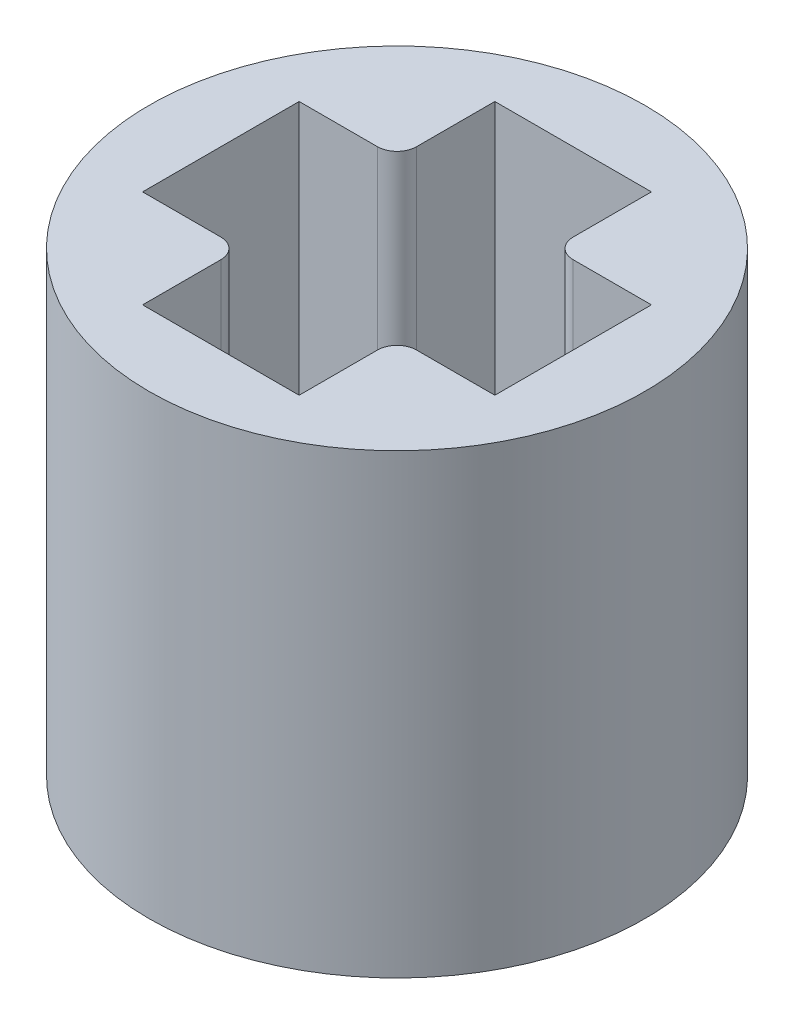
ISO-10303-21;
HEADER;
FILE_DESCRIPTION(('STEP AP214'),'2;1');
FILE_NAME('part.step','',(''),(''),'','','');
FILE_SCHEMA(('AUTOMOTIVE_DESIGN { 1 0 10303 214 1 1 1 1 }'));
ENDSEC;
DATA;
#1=APPLICATION_CONTEXT('core data for automotive mechanical design processes');
#2=APPLICATION_PROTOCOL_DEFINITION('international standard','automotive_design',2000,#1);
#3=PRODUCT_CONTEXT('',#1,'mechanical');
#4=PRODUCT('Part','Part','',(#3));
#5=PRODUCT_RELATED_PRODUCT_CATEGORY('part','',(#4));
#6=PRODUCT_DEFINITION_FORMATION('','',#4);
#7=PRODUCT_DEFINITION_CONTEXT('part definition',#1,'design');
#8=PRODUCT_DEFINITION('design','',#6,#7);
#9=PRODUCT_DEFINITION_SHAPE('','',#8);
#10=(LENGTH_UNIT() NAMED_UNIT(*) SI_UNIT(.MILLI.,.METRE.));
#11=(NAMED_UNIT(*) PLANE_ANGLE_UNIT() SI_UNIT($,.RADIAN.));
#12=(NAMED_UNIT(*) SI_UNIT($,.STERADIAN.) SOLID_ANGLE_UNIT());
#13=UNCERTAINTY_MEASURE_WITH_UNIT(LENGTH_MEASURE(1.E-05),#10,'distance_accuracy_value','');
#14=(GEOMETRIC_REPRESENTATION_CONTEXT(3) GLOBAL_UNCERTAINTY_ASSIGNED_CONTEXT((#13)) GLOBAL_UNIT_ASSIGNED_CONTEXT((#10,
#11,#12)) REPRESENTATION_CONTEXT('',''));
#15=CARTESIAN_POINT('',(0.,0.,0.));
#16=DIRECTION('',(0.,0.,1.));
#17=DIRECTION('',(1.,0.,0.));
#18=AXIS2_PLACEMENT_3D('',#15,#16,#17);
#19=CARTESIAN_POINT('',(0.,7.,0.));
#20=DIRECTION('',(0.,1.,0.));
#21=DIRECTION('',(0.,0.,1.));
#22=AXIS2_PLACEMENT_3D('',#19,#20,#21);
#23=PLANE('',#22);
#24=CARTESIAN_POINT('',(0.,7.,0.));
#25=DIRECTION('',(0.,1.,0.));
#26=DIRECTION('',(0.,0.,1.));
#27=AXIS2_PLACEMENT_3D('',#24,#25,#26);
#28=CIRCLE('',#27,3.8);
#29=CARTESIAN_POINT('',(0.,7.,3.8));
#30=VERTEX_POINT('',#29);
#31=EDGE_CURVE('E11',#30,#30,#28,.T.);
#32=ORIENTED_EDGE('',*,*,#31,.T.);
#33=EDGE_LOOP('',(#32));
#34=FACE_BOUND('',#33,.T.);
#35=DIRECTION('',(1.,0.,0.));
#36=VECTOR('',#35,1.);
#37=CARTESIAN_POINT('',(1.5,7.,1.2));
#38=LINE('',#37,#36);
#39=CARTESIAN_POINT('',(1.5,7.,1.2));
#40=VERTEX_POINT('',#39);
#41=CARTESIAN_POINT('',(2.7,7.,1.2));
#42=VERTEX_POINT('',#41);
#43=EDGE_CURVE('E162',#40,#42,#38,.T.);
#44=ORIENTED_EDGE('',*,*,#43,.F.);
#45=CARTESIAN_POINT('',(1.5,7.,1.5));
#46=DIRECTION('',(0.,-1.,0.));
#47=DIRECTION('',(0.,0.,-1.));
#48=AXIS2_PLACEMENT_3D('',#45,#46,#47);
#49=CIRCLE('',#48,0.3);
#50=CARTESIAN_POINT('',(1.2,7.,1.5));
#51=VERTEX_POINT('',#50);
#52=EDGE_CURVE('E153',#51,#40,#49,.T.);
#53=ORIENTED_EDGE('',*,*,#52,.F.);
#54=DIRECTION('',(0.,0.,-1.));
#55=VECTOR('',#54,1.);
#56=CARTESIAN_POINT('',(1.2,7.,2.7));
#57=LINE('',#56,#55);
#58=CARTESIAN_POINT('',(1.2,7.,2.7));
#59=VERTEX_POINT('',#58);
#60=EDGE_CURVE('E217',#59,#51,#57,.T.);
#61=ORIENTED_EDGE('',*,*,#60,.F.);
#62=DIRECTION('',(1.,0.,0.));
#63=VECTOR('',#62,1.);
#64=CARTESIAN_POINT('',(-1.2,7.,2.7));
#65=LINE('',#64,#63);
#66=CARTESIAN_POINT('',(-1.2,7.,2.7));
#67=VERTEX_POINT('',#66);
#68=EDGE_CURVE('E214',#67,#59,#65,.T.);
#69=ORIENTED_EDGE('',*,*,#68,.F.);
#70=DIRECTION('',(0.,0.,1.));
#71=VECTOR('',#70,1.);
#72=CARTESIAN_POINT('',(-1.2,7.,2.7));
#73=LINE('',#72,#71);
#74=CARTESIAN_POINT('',(-1.2,7.,1.5));
#75=VERTEX_POINT('',#74);
#76=EDGE_CURVE('E211',#75,#67,#73,.T.);
#77=ORIENTED_EDGE('',*,*,#76,.F.);
#78=CARTESIAN_POINT('',(-1.5,7.,1.5));
#79=DIRECTION('',(0.,-1.,0.));
#80=DIRECTION('',(0.,0.,-1.));
#81=AXIS2_PLACEMENT_3D('',#78,#79,#80);
#82=CIRCLE('',#81,0.3);
#83=CARTESIAN_POINT('',(-1.5,7.,1.2));
#84=VERTEX_POINT('',#83);
#85=EDGE_CURVE('E208',#84,#75,#82,.T.);
#86=ORIENTED_EDGE('',*,*,#85,.F.);
#87=DIRECTION('',(1.,0.,0.));
#88=VECTOR('',#87,1.);
#89=CARTESIAN_POINT('',(-1.5,7.,1.2));
#90=LINE('',#89,#88);
#91=CARTESIAN_POINT('',(-2.7,7.,1.2));
#92=VERTEX_POINT('',#91);
#93=EDGE_CURVE('E205',#92,#84,#90,.T.);
#94=ORIENTED_EDGE('',*,*,#93,.F.);
#95=DIRECTION('',(0.,0.,1.));
#96=VECTOR('',#95,1.);
#97=CARTESIAN_POINT('',(-2.7,7.,1.2));
#98=LINE('',#97,#96);
#99=CARTESIAN_POINT('',(-2.7,7.,-1.2));
#100=VERTEX_POINT('',#99);
#101=EDGE_CURVE('E202',#100,#92,#98,.T.);
#102=ORIENTED_EDGE('',*,*,#101,.F.);
#103=DIRECTION('',(-1.,0.,0.));
#104=VECTOR('',#103,1.);
#105=CARTESIAN_POINT('',(-1.5,7.,-1.2));
#106=LINE('',#105,#104);
#107=CARTESIAN_POINT('',(-1.5,7.,-1.2));
#108=VERTEX_POINT('',#107);
#109=EDGE_CURVE('E199',#108,#100,#106,.T.);
#110=ORIENTED_EDGE('',*,*,#109,.F.);
#111=CARTESIAN_POINT('',(-1.5,7.,-1.5));
#112=DIRECTION('',(0.,-1.,0.));
#113=DIRECTION('',(0.,0.,-1.));
#114=AXIS2_PLACEMENT_3D('',#111,#112,#113);
#115=CIRCLE('',#114,0.3);
#116=CARTESIAN_POINT('',(-1.2,7.,-1.5));
#117=VERTEX_POINT('',#116);
#118=EDGE_CURVE('E196',#117,#108,#115,.T.);
#119=ORIENTED_EDGE('',*,*,#118,.F.);
#120=DIRECTION('',(0.,0.,1.));
#121=VECTOR('',#120,1.);
#122=CARTESIAN_POINT('',(-1.2,7.,-2.7));
#123=LINE('',#122,#121);
#124=CARTESIAN_POINT('',(-1.2,7.,-2.7));
#125=VERTEX_POINT('',#124);
#126=EDGE_CURVE('E193',#125,#117,#123,.T.);
#127=ORIENTED_EDGE('',*,*,#126,.F.);
#128=DIRECTION('',(-1.,0.,0.));
#129=VECTOR('',#128,1.);
#130=CARTESIAN_POINT('',(-1.2,7.,-2.7));
#131=LINE('',#130,#129);
#132=CARTESIAN_POINT('',(1.2,7.,-2.7));
#133=VERTEX_POINT('',#132);
#134=EDGE_CURVE('E190',#133,#125,#131,.T.);
#135=ORIENTED_EDGE('',*,*,#134,.F.);
#136=DIRECTION('',(0.,0.,-1.));
#137=VECTOR('',#136,1.);
#138=CARTESIAN_POINT('',(1.2,7.,-2.7));
#139=LINE('',#138,#137);
#140=CARTESIAN_POINT('',(1.2,7.,-1.5));
#141=VERTEX_POINT('',#140);
#142=EDGE_CURVE('E187',#141,#133,#139,.T.);
#143=ORIENTED_EDGE('',*,*,#142,.F.);
#144=CARTESIAN_POINT('',(1.5,7.,-1.5));
#145=DIRECTION('',(0.,-1.,0.));
#146=DIRECTION('',(0.,0.,-1.));
#147=AXIS2_PLACEMENT_3D('',#144,#145,#146);
#148=CIRCLE('',#147,0.3);
#149=CARTESIAN_POINT('',(1.5,7.,-1.2));
#150=VERTEX_POINT('',#149);
#151=EDGE_CURVE('E184',#150,#141,#148,.T.);
#152=ORIENTED_EDGE('',*,*,#151,.F.);
#153=DIRECTION('',(-1.,0.,0.));
#154=VECTOR('',#153,1.);
#155=CARTESIAN_POINT('',(1.5,7.,-1.2));
#156=LINE('',#155,#154);
#157=CARTESIAN_POINT('',(2.7,7.,-1.2));
#158=VERTEX_POINT('',#157);
#159=EDGE_CURVE('E179',#158,#150,#156,.T.);
#160=ORIENTED_EDGE('',*,*,#159,.F.);
#161=DIRECTION('',(0.,0.,-1.));
#162=VECTOR('',#161,1.);
#163=CARTESIAN_POINT('',(2.7,7.,1.2));
#164=LINE('',#163,#162);
#165=EDGE_CURVE('E175',#42,#158,#164,.T.);
#166=ORIENTED_EDGE('',*,*,#165,.F.);
#167=EDGE_LOOP('',(#44,#53,#61,#69,#77,#86,#94,#102,#110,#119,#127,#135,#143,#152,#160,#166));
#168=FACE_BOUND('',#167,.T.);
#169=ADVANCED_FACE('F39',(#34,#168),#23,.T.);
#170=CARTESIAN_POINT('',(0.,0.,0.));
#171=DIRECTION('',(0.,1.,0.));
#172=DIRECTION('',(0.,0.,1.));
#173=AXIS2_PLACEMENT_3D('',#170,#171,#172);
#174=PLANE('',#173);
#175=CARTESIAN_POINT('',(0.,0.,0.));
#176=DIRECTION('',(0.,1.,0.));
#177=DIRECTION('',(0.,0.,1.));
#178=AXIS2_PLACEMENT_3D('',#175,#176,#177);
#179=CIRCLE('',#178,3.8);
#180=CARTESIAN_POINT('',(0.,0.,3.8));
#181=VERTEX_POINT('',#180);
#182=EDGE_CURVE('E43',#181,#181,#179,.T.);
#183=ORIENTED_EDGE('',*,*,#182,.F.);
#184=EDGE_LOOP('',(#183));
#185=FACE_BOUND('',#184,.T.);
#186=CARTESIAN_POINT('',(1.5,0.,1.5));
#187=DIRECTION('',(0.,-1.,0.));
#188=DIRECTION('',(0.,0.,-1.));
#189=AXIS2_PLACEMENT_3D('',#186,#187,#188);
#190=CIRCLE('',#189,0.3);
#191=CARTESIAN_POINT('',(1.2,0.,1.5));
#192=VERTEX_POINT('',#191);
#193=CARTESIAN_POINT('',(1.5,0.,1.2));
#194=VERTEX_POINT('',#193);
#195=EDGE_CURVE('E63',#192,#194,#190,.T.);
#196=ORIENTED_EDGE('',*,*,#195,.T.);
#197=DIRECTION('',(1.,0.,0.));
#198=VECTOR('',#197,1.);
#199=CARTESIAN_POINT('',(1.5,0.,1.2));
#200=LINE('',#199,#198);
#201=CARTESIAN_POINT('',(2.7,0.,1.2));
#202=VERTEX_POINT('',#201);
#203=EDGE_CURVE('E169',#194,#202,#200,.T.);
#204=ORIENTED_EDGE('',*,*,#203,.T.);
#205=DIRECTION('',(0.,0.,-1.));
#206=VECTOR('',#205,1.);
#207=CARTESIAN_POINT('',(2.7,0.,1.2));
#208=LINE('',#207,#206);
#209=CARTESIAN_POINT('',(2.7,0.,-1.2));
#210=VERTEX_POINT('',#209);
#211=EDGE_CURVE('E224',#202,#210,#208,.T.);
#212=ORIENTED_EDGE('',*,*,#211,.T.);
#213=DIRECTION('',(-1.,0.,0.));
#214=VECTOR('',#213,1.);
#215=CARTESIAN_POINT('',(1.5,0.,-1.2));
#216=LINE('',#215,#214);
#217=CARTESIAN_POINT('',(1.5,0.,-1.2));
#218=VERTEX_POINT('',#217);
#219=EDGE_CURVE('E228',#210,#218,#216,.T.);
#220=ORIENTED_EDGE('',*,*,#219,.T.);
#221=CARTESIAN_POINT('',(1.5,0.,-1.5));
#222=DIRECTION('',(0.,-1.,0.));
#223=DIRECTION('',(0.,0.,-1.));
#224=AXIS2_PLACEMENT_3D('',#221,#222,#223);
#225=CIRCLE('',#224,0.3);
#226=CARTESIAN_POINT('',(1.2,0.,-1.5));
#227=VERTEX_POINT('',#226);
#228=EDGE_CURVE('E232',#218,#227,#225,.T.);
#229=ORIENTED_EDGE('',*,*,#228,.T.);
#230=DIRECTION('',(0.,0.,-1.));
#231=VECTOR('',#230,1.);
#232=CARTESIAN_POINT('',(1.2,0.,-2.7));
#233=LINE('',#232,#231);
#234=CARTESIAN_POINT('',(1.2,0.,-2.7));
#235=VERTEX_POINT('',#234);
#236=EDGE_CURVE('E236',#227,#235,#233,.T.);
#237=ORIENTED_EDGE('',*,*,#236,.T.);
#238=DIRECTION('',(-1.,0.,0.));
#239=VECTOR('',#238,1.);
#240=CARTESIAN_POINT('',(-1.2,0.,-2.7));
#241=LINE('',#240,#239);
#242=CARTESIAN_POINT('',(-1.2,0.,-2.7));
#243=VERTEX_POINT('',#242);
#244=EDGE_CURVE('E240',#235,#243,#241,.T.);
#245=ORIENTED_EDGE('',*,*,#244,.T.);
#246=DIRECTION('',(0.,0.,1.));
#247=VECTOR('',#246,1.);
#248=CARTESIAN_POINT('',(-1.2,0.,-2.7));
#249=LINE('',#248,#247);
#250=CARTESIAN_POINT('',(-1.2,0.,-1.5));
#251=VERTEX_POINT('',#250);
#252=EDGE_CURVE('E244',#243,#251,#249,.T.);
#253=ORIENTED_EDGE('',*,*,#252,.T.);
#254=CARTESIAN_POINT('',(-1.5,0.,-1.5));
#255=DIRECTION('',(0.,-1.,0.));
#256=DIRECTION('',(0.,0.,-1.));
#257=AXIS2_PLACEMENT_3D('',#254,#255,#256);
#258=CIRCLE('',#257,0.3);
#259=CARTESIAN_POINT('',(-1.5,0.,-1.2));
#260=VERTEX_POINT('',#259);
#261=EDGE_CURVE('E248',#251,#260,#258,.T.);
#262=ORIENTED_EDGE('',*,*,#261,.T.);
#263=DIRECTION('',(-1.,0.,0.));
#264=VECTOR('',#263,1.);
#265=CARTESIAN_POINT('',(-1.5,0.,-1.2));
#266=LINE('',#265,#264);
#267=CARTESIAN_POINT('',(-2.7,0.,-1.2));
#268=VERTEX_POINT('',#267);
#269=EDGE_CURVE('E252',#260,#268,#266,.T.);
#270=ORIENTED_EDGE('',*,*,#269,.T.);
#271=DIRECTION('',(0.,0.,1.));
#272=VECTOR('',#271,1.);
#273=CARTESIAN_POINT('',(-2.7,0.,1.2));
#274=LINE('',#273,#272);
#275=CARTESIAN_POINT('',(-2.7,0.,1.2));
#276=VERTEX_POINT('',#275);
#277=EDGE_CURVE('E256',#268,#276,#274,.T.);
#278=ORIENTED_EDGE('',*,*,#277,.T.);
#279=DIRECTION('',(1.,0.,0.));
#280=VECTOR('',#279,1.);
#281=CARTESIAN_POINT('',(-1.5,0.,1.2));
#282=LINE('',#281,#280);
#283=CARTESIAN_POINT('',(-1.5,0.,1.2));
#284=VERTEX_POINT('',#283);
#285=EDGE_CURVE('E260',#276,#284,#282,.T.);
#286=ORIENTED_EDGE('',*,*,#285,.T.);
#287=CARTESIAN_POINT('',(-1.5,0.,1.5));
#288=DIRECTION('',(0.,-1.,0.));
#289=DIRECTION('',(0.,0.,-1.));
#290=AXIS2_PLACEMENT_3D('',#287,#288,#289);
#291=CIRCLE('',#290,0.3);
#292=CARTESIAN_POINT('',(-1.2,0.,1.5));
#293=VERTEX_POINT('',#292);
#294=EDGE_CURVE('E264',#284,#293,#291,.T.);
#295=ORIENTED_EDGE('',*,*,#294,.T.);
#296=DIRECTION('',(0.,0.,1.));
#297=VECTOR('',#296,1.);
#298=CARTESIAN_POINT('',(-1.2,0.,2.7));
#299=LINE('',#298,#297);
#300=CARTESIAN_POINT('',(-1.2,0.,2.7));
#301=VERTEX_POINT('',#300);
#302=EDGE_CURVE('E268',#293,#301,#299,.T.);
#303=ORIENTED_EDGE('',*,*,#302,.T.);
#304=DIRECTION('',(1.,0.,0.));
#305=VECTOR('',#304,1.);
#306=CARTESIAN_POINT('',(-1.2,0.,2.7));
#307=LINE('',#306,#305);
#308=CARTESIAN_POINT('',(1.2,0.,2.7));
#309=VERTEX_POINT('',#308);
#310=EDGE_CURVE('E272',#301,#309,#307,.T.);
#311=ORIENTED_EDGE('',*,*,#310,.T.);
#312=DIRECTION('',(0.,0.,-1.));
#313=VECTOR('',#312,1.);
#314=CARTESIAN_POINT('',(1.2,0.,2.7));
#315=LINE('',#314,#313);
#316=EDGE_CURVE('E163',#309,#192,#315,.T.);
#317=ORIENTED_EDGE('',*,*,#316,.T.);
#318=EDGE_LOOP('',(#196,#204,#212,#220,#229,#237,#245,#253,#262,#270,#278,#286,#295,#303,#311,#317));
#319=FACE_BOUND('',#318,.T.);
#320=ADVANCED_FACE('F326',(#185,#319),#174,.F.);
#321=CARTESIAN_POINT('',(0.,7.,0.));
#322=DIRECTION('',(0.,-1.,0.));
#323=DIRECTION('',(0.,0.,-1.));
#324=AXIS2_PLACEMENT_3D('',#321,#322,#323);
#325=CYLINDRICAL_SURFACE('',#324,3.8);
#326=ORIENTED_EDGE('',*,*,#31,.F.);
#327=EDGE_LOOP('',(#326));
#328=FACE_BOUND('',#327,.T.);
#329=ORIENTED_EDGE('',*,*,#182,.T.);
#330=EDGE_LOOP('',(#329));
#331=FACE_BOUND('',#330,.T.);
#332=ADVANCED_FACE('F41',(#328,#331),#325,.T.);
#333=CARTESIAN_POINT('',(1.5,7.,1.5));
#334=DIRECTION('',(0.,-1.,0.));
#335=DIRECTION('',(0.,0.,-1.));
#336=AXIS2_PLACEMENT_3D('',#333,#334,#335);
#337=CYLINDRICAL_SURFACE('',#336,0.3);
#338=ORIENTED_EDGE('',*,*,#195,.F.);
#339=DIRECTION('',(0.,-1.,0.));
#340=VECTOR('',#339,1.);
#341=CARTESIAN_POINT('',(1.2,7.,1.5));
#342=LINE('',#341,#340);
#343=EDGE_CURVE('E157',#51,#192,#342,.T.);
#344=ORIENTED_EDGE('',*,*,#343,.F.);
#345=ORIENTED_EDGE('',*,*,#52,.T.);
#346=DIRECTION('',(0.,-1.,0.));
#347=VECTOR('',#346,1.);
#348=CARTESIAN_POINT('',(1.5,7.,1.2));
#349=LINE('',#348,#347);
#350=EDGE_CURVE('E156',#40,#194,#349,.T.);
#351=ORIENTED_EDGE('',*,*,#350,.T.);
#352=EDGE_LOOP('',(#338,#344,#345,#351));
#353=FACE_BOUND('',#352,.T.);
#354=ADVANCED_FACE('F155',(#353),#337,.T.);
#355=CARTESIAN_POINT('',(1.5,7.,1.2));
#356=DIRECTION('',(0.,0.,-1.));
#357=DIRECTION('',(-1.,0.,0.));
#358=AXIS2_PLACEMENT_3D('',#355,#356,#357);
#359=PLANE('',#358);
#360=ORIENTED_EDGE('',*,*,#203,.F.);
#361=ORIENTED_EDGE('',*,*,#350,.F.);
#362=ORIENTED_EDGE('',*,*,#43,.T.);
#363=DIRECTION('',(0.,-1.,0.));
#364=VECTOR('',#363,1.);
#365=CARTESIAN_POINT('',(2.7,7.,1.2));
#366=LINE('',#365,#364);
#367=EDGE_CURVE('E171',#42,#202,#366,.T.);
#368=ORIENTED_EDGE('',*,*,#367,.T.);
#369=EDGE_LOOP('',(#360,#361,#362,#368));
#370=FACE_BOUND('',#369,.T.);
#371=ADVANCED_FACE('F166',(#370),#359,.T.);
#372=CARTESIAN_POINT('',(2.7,7.,1.2));
#373=DIRECTION('',(-1.,0.,0.));
#374=DIRECTION('',(0.,0.,1.));
#375=AXIS2_PLACEMENT_3D('',#372,#373,#374);
#376=PLANE('',#375);
#377=ORIENTED_EDGE('',*,*,#211,.F.);
#378=ORIENTED_EDGE('',*,*,#367,.F.);
#379=ORIENTED_EDGE('',*,*,#165,.T.);
#380=DIRECTION('',(0.,-1.,0.));
#381=VECTOR('',#380,1.);
#382=CARTESIAN_POINT('',(2.7,7.,-1.2));
#383=LINE('',#382,#381);
#384=EDGE_CURVE('E316',#158,#210,#383,.T.);
#385=ORIENTED_EDGE('',*,*,#384,.T.);
#386=EDGE_LOOP('',(#377,#378,#379,#385));
#387=FACE_BOUND('',#386,.T.);
#388=ADVANCED_FACE('F322',(#387),#376,.T.);
#389=CARTESIAN_POINT('',(1.5,7.,-1.2));
#390=DIRECTION('',(0.,0.,1.));
#391=DIRECTION('',(1.,0.,0.));
#392=AXIS2_PLACEMENT_3D('',#389,#390,#391);
#393=PLANE('',#392);
#394=ORIENTED_EDGE('',*,*,#219,.F.);
#395=ORIENTED_EDGE('',*,*,#384,.F.);
#396=ORIENTED_EDGE('',*,*,#159,.T.);
#397=DIRECTION('',(0.,-1.,0.));
#398=VECTOR('',#397,1.);
#399=CARTESIAN_POINT('',(1.5,7.,-1.2));
#400=LINE('',#399,#398);
#401=EDGE_CURVE('E313',#150,#218,#400,.T.);
#402=ORIENTED_EDGE('',*,*,#401,.T.);
#403=EDGE_LOOP('',(#394,#395,#396,#402));
#404=FACE_BOUND('',#403,.T.);
#405=ADVANCED_FACE('F384',(#404),#393,.T.);
#406=CARTESIAN_POINT('',(1.5,7.,-1.5));
#407=DIRECTION('',(0.,-1.,0.));
#408=DIRECTION('',(0.,0.,-1.));
#409=AXIS2_PLACEMENT_3D('',#406,#407,#408);
#410=CYLINDRICAL_SURFACE('',#409,0.3);
#411=ORIENTED_EDGE('',*,*,#228,.F.);
#412=ORIENTED_EDGE('',*,*,#401,.F.);
#413=ORIENTED_EDGE('',*,*,#151,.T.);
#414=DIRECTION('',(0.,-1.,0.));
#415=VECTOR('',#414,1.);
#416=CARTESIAN_POINT('',(1.2,7.,-1.5));
#417=LINE('',#416,#415);
#418=EDGE_CURVE('E310',#141,#227,#417,.T.);
#419=ORIENTED_EDGE('',*,*,#418,.T.);
#420=EDGE_LOOP('',(#411,#412,#413,#419));
#421=FACE_BOUND('',#420,.T.);
#422=ADVANCED_FACE('F381',(#421),#410,.T.);
#423=CARTESIAN_POINT('',(1.2,7.,-2.7));
#424=DIRECTION('',(-1.,0.,0.));
#425=DIRECTION('',(0.,0.,1.));
#426=AXIS2_PLACEMENT_3D('',#423,#424,#425);
#427=PLANE('',#426);
#428=ORIENTED_EDGE('',*,*,#236,.F.);
#429=ORIENTED_EDGE('',*,*,#418,.F.);
#430=ORIENTED_EDGE('',*,*,#142,.T.);
#431=DIRECTION('',(0.,-1.,0.));
#432=VECTOR('',#431,1.);
#433=CARTESIAN_POINT('',(1.2,7.,-2.7));
#434=LINE('',#433,#432);
#435=EDGE_CURVE('E307',#133,#235,#434,.T.);
#436=ORIENTED_EDGE('',*,*,#435,.T.);
#437=EDGE_LOOP('',(#428,#429,#430,#436));
#438=FACE_BOUND('',#437,.T.);
#439=ADVANCED_FACE('F378',(#438),#427,.T.);
#440=CARTESIAN_POINT('',(-1.2,7.,-2.7));
#441=DIRECTION('',(0.,0.,1.));
#442=DIRECTION('',(1.,0.,0.));
#443=AXIS2_PLACEMENT_3D('',#440,#441,#442);
#444=PLANE('',#443);
#445=ORIENTED_EDGE('',*,*,#244,.F.);
#446=ORIENTED_EDGE('',*,*,#435,.F.);
#447=ORIENTED_EDGE('',*,*,#134,.T.);
#448=DIRECTION('',(0.,-1.,0.));
#449=VECTOR('',#448,1.);
#450=CARTESIAN_POINT('',(-1.2,7.,-2.7));
#451=LINE('',#450,#449);
#452=EDGE_CURVE('E304',#125,#243,#451,.T.);
#453=ORIENTED_EDGE('',*,*,#452,.T.);
#454=EDGE_LOOP('',(#445,#446,#447,#453));
#455=FACE_BOUND('',#454,.T.);
#456=ADVANCED_FACE('F371',(#455),#444,.T.);
#457=CARTESIAN_POINT('',(-1.2,7.,-2.7));
#458=DIRECTION('',(1.,0.,0.));
#459=DIRECTION('',(0.,0.,-1.));
#460=AXIS2_PLACEMENT_3D('',#457,#458,#459);
#461=PLANE('',#460);
#462=ORIENTED_EDGE('',*,*,#252,.F.);
#463=ORIENTED_EDGE('',*,*,#452,.F.);
#464=ORIENTED_EDGE('',*,*,#126,.T.);
#465=DIRECTION('',(0.,-1.,0.));
#466=VECTOR('',#465,1.);
#467=CARTESIAN_POINT('',(-1.2,7.,-1.5));
#468=LINE('',#467,#466);
#469=EDGE_CURVE('E301',#117,#251,#468,.T.);
#470=ORIENTED_EDGE('',*,*,#469,.T.);
#471=EDGE_LOOP('',(#462,#463,#464,#470));
#472=FACE_BOUND('',#471,.T.);
#473=ADVANCED_FACE('F367',(#472),#461,.T.);
#474=CARTESIAN_POINT('',(-1.5,7.,-1.5));
#475=DIRECTION('',(0.,-1.,0.));
#476=DIRECTION('',(0.,0.,-1.));
#477=AXIS2_PLACEMENT_3D('',#474,#475,#476);
#478=CYLINDRICAL_SURFACE('',#477,0.3);
#479=ORIENTED_EDGE('',*,*,#261,.F.);
#480=ORIENTED_EDGE('',*,*,#469,.F.);
#481=ORIENTED_EDGE('',*,*,#118,.T.);
#482=DIRECTION('',(0.,-1.,0.));
#483=VECTOR('',#482,1.);
#484=CARTESIAN_POINT('',(-1.5,7.,-1.2));
#485=LINE('',#484,#483);
#486=EDGE_CURVE('E298',#108,#260,#485,.T.);
#487=ORIENTED_EDGE('',*,*,#486,.T.);
#488=EDGE_LOOP('',(#479,#480,#481,#487));
#489=FACE_BOUND('',#488,.T.);
#490=ADVANCED_FACE('F364',(#489),#478,.T.);
#491=CARTESIAN_POINT('',(-1.5,7.,-1.2));
#492=DIRECTION('',(0.,0.,1.));
#493=DIRECTION('',(1.,0.,0.));
#494=AXIS2_PLACEMENT_3D('',#491,#492,#493);
#495=PLANE('',#494);
#496=ORIENTED_EDGE('',*,*,#269,.F.);
#497=ORIENTED_EDGE('',*,*,#486,.F.);
#498=ORIENTED_EDGE('',*,*,#109,.T.);
#499=DIRECTION('',(0.,-1.,0.));
#500=VECTOR('',#499,1.);
#501=CARTESIAN_POINT('',(-2.7,7.,-1.2));
#502=LINE('',#501,#500);
#503=EDGE_CURVE('E295',#100,#268,#502,.T.);
#504=ORIENTED_EDGE('',*,*,#503,.T.);
#505=EDGE_LOOP('',(#496,#497,#498,#504));
#506=FACE_BOUND('',#505,.T.);
#507=ADVANCED_FACE('F356',(#506),#495,.T.);
#508=CARTESIAN_POINT('',(-2.7,7.,1.2));
#509=DIRECTION('',(1.,0.,0.));
#510=DIRECTION('',(0.,0.,-1.));
#511=AXIS2_PLACEMENT_3D('',#508,#509,#510);
#512=PLANE('',#511);
#513=ORIENTED_EDGE('',*,*,#277,.F.);
#514=ORIENTED_EDGE('',*,*,#503,.F.);
#515=ORIENTED_EDGE('',*,*,#101,.T.);
#516=DIRECTION('',(0.,-1.,0.));
#517=VECTOR('',#516,1.);
#518=CARTESIAN_POINT('',(-2.7,7.,1.2));
#519=LINE('',#518,#517);
#520=EDGE_CURVE('E292',#92,#276,#519,.T.);
#521=ORIENTED_EDGE('',*,*,#520,.T.);
#522=EDGE_LOOP('',(#513,#514,#515,#521));
#523=FACE_BOUND('',#522,.T.);
#524=ADVANCED_FACE('F352',(#523),#512,.T.);
#525=CARTESIAN_POINT('',(-1.5,7.,1.2));
#526=DIRECTION('',(0.,0.,-1.));
#527=DIRECTION('',(-1.,0.,0.));
#528=AXIS2_PLACEMENT_3D('',#525,#526,#527);
#529=PLANE('',#528);
#530=ORIENTED_EDGE('',*,*,#285,.F.);
#531=ORIENTED_EDGE('',*,*,#520,.F.);
#532=ORIENTED_EDGE('',*,*,#93,.T.);
#533=DIRECTION('',(0.,-1.,0.));
#534=VECTOR('',#533,1.);
#535=CARTESIAN_POINT('',(-1.5,7.,1.2));
#536=LINE('',#535,#534);
#537=EDGE_CURVE('E289',#84,#284,#536,.T.);
#538=ORIENTED_EDGE('',*,*,#537,.T.);
#539=EDGE_LOOP('',(#530,#531,#532,#538));
#540=FACE_BOUND('',#539,.T.);
#541=ADVANCED_FACE('F349',(#540),#529,.T.);
#542=CARTESIAN_POINT('',(-1.5,7.,1.5));
#543=DIRECTION('',(0.,-1.,0.));
#544=DIRECTION('',(0.,0.,-1.));
#545=AXIS2_PLACEMENT_3D('',#542,#543,#544);
#546=CYLINDRICAL_SURFACE('',#545,0.3);
#547=ORIENTED_EDGE('',*,*,#294,.F.);
#548=ORIENTED_EDGE('',*,*,#537,.F.);
#549=ORIENTED_EDGE('',*,*,#85,.T.);
#550=DIRECTION('',(0.,-1.,0.));
#551=VECTOR('',#550,1.);
#552=CARTESIAN_POINT('',(-1.2,7.,1.5));
#553=LINE('',#552,#551);
#554=EDGE_CURVE('E286',#75,#293,#553,.T.);
#555=ORIENTED_EDGE('',*,*,#554,.T.);
#556=EDGE_LOOP('',(#547,#548,#549,#555));
#557=FACE_BOUND('',#556,.T.);
#558=ADVANCED_FACE('F341',(#557),#546,.T.);
#559=CARTESIAN_POINT('',(-1.2,7.,2.7));
#560=DIRECTION('',(1.,0.,0.));
#561=DIRECTION('',(0.,0.,-1.));
#562=AXIS2_PLACEMENT_3D('',#559,#560,#561);
#563=PLANE('',#562);
#564=ORIENTED_EDGE('',*,*,#302,.F.);
#565=ORIENTED_EDGE('',*,*,#554,.F.);
#566=ORIENTED_EDGE('',*,*,#76,.T.);
#567=DIRECTION('',(0.,-1.,0.));
#568=VECTOR('',#567,1.);
#569=CARTESIAN_POINT('',(-1.2,7.,2.7));
#570=LINE('',#569,#568);
#571=EDGE_CURVE('E283',#67,#301,#570,.T.);
#572=ORIENTED_EDGE('',*,*,#571,.T.);
#573=EDGE_LOOP('',(#564,#565,#566,#572));
#574=FACE_BOUND('',#573,.T.);
#575=ADVANCED_FACE('F337',(#574),#563,.T.);
#576=CARTESIAN_POINT('',(-1.2,7.,2.7));
#577=DIRECTION('',(0.,0.,-1.));
#578=DIRECTION('',(-1.,0.,0.));
#579=AXIS2_PLACEMENT_3D('',#576,#577,#578);
#580=PLANE('',#579);
#581=ORIENTED_EDGE('',*,*,#310,.F.);
#582=ORIENTED_EDGE('',*,*,#571,.F.);
#583=ORIENTED_EDGE('',*,*,#68,.T.);
#584=DIRECTION('',(0.,-1.,0.));
#585=VECTOR('',#584,1.);
#586=CARTESIAN_POINT('',(1.2,7.,2.7));
#587=LINE('',#586,#585);
#588=EDGE_CURVE('E55',#59,#309,#587,.T.);
#589=ORIENTED_EDGE('',*,*,#588,.T.);
#590=EDGE_LOOP('',(#581,#582,#583,#589));
#591=FACE_BOUND('',#590,.T.);
#592=ADVANCED_FACE('F334',(#591),#580,.T.);
#593=CARTESIAN_POINT('',(1.2,7.,2.7));
#594=DIRECTION('',(-1.,0.,0.));
#595=DIRECTION('',(0.,0.,1.));
#596=AXIS2_PLACEMENT_3D('',#593,#594,#595);
#597=PLANE('',#596);
#598=ORIENTED_EDGE('',*,*,#316,.F.);
#599=ORIENTED_EDGE('',*,*,#588,.F.);
#600=ORIENTED_EDGE('',*,*,#60,.T.);
#601=ORIENTED_EDGE('',*,*,#343,.T.);
#602=EDGE_LOOP('',(#598,#599,#600,#601));
#603=FACE_BOUND('',#602,.T.);
#604=ADVANCED_FACE('F328',(#603),#597,.T.);
#605=CLOSED_SHELL('',(#169,#320,#332,#354,#371,#388,#405,#422,#439,#456,#473,#490,#507,#524,
#541,#558,#575,#592,#604));
#606=MANIFOLD_SOLID_BREP('B2',#605);
#607=ADVANCED_BREP_SHAPE_REPRESENTATION('',(#18,#606),#14);
#608=SHAPE_DEFINITION_REPRESENTATION(#9,#607);
ENDSEC;
END-ISO-10303-21;
